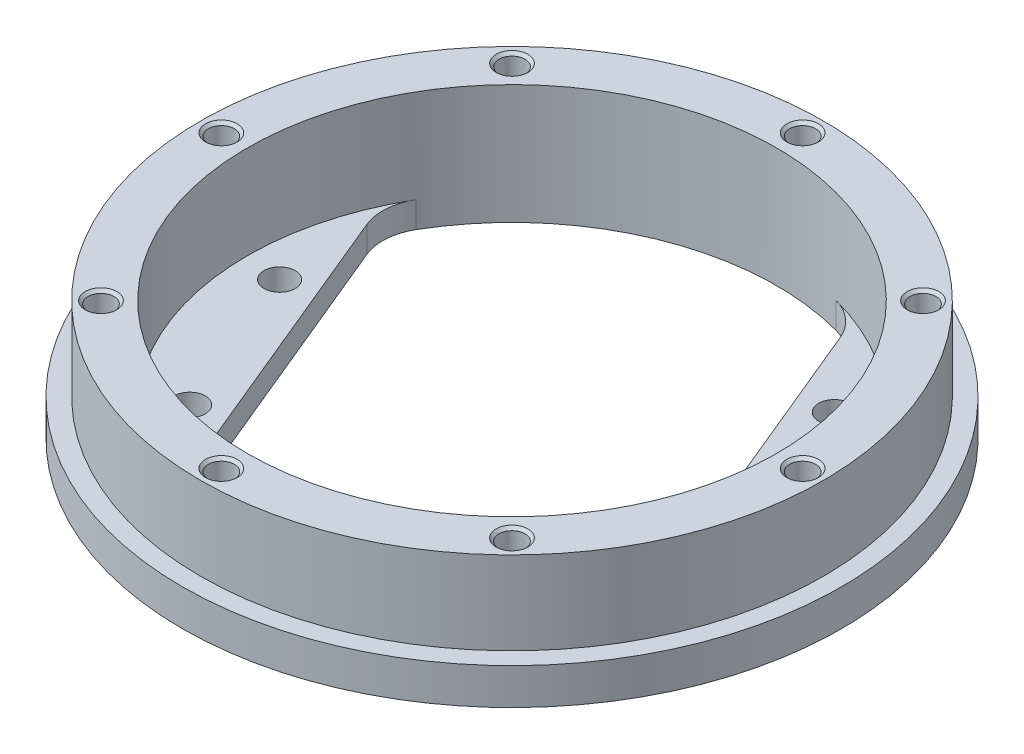
ISO-10303-21;
HEADER;
FILE_DESCRIPTION(('STEP AP214'),'2;1');
FILE_NAME('part.step','',(''),(''),'','','');
FILE_SCHEMA(('AUTOMOTIVE_DESIGN { 1 0 10303 214 1 1 1 1 }'));
ENDSEC;
DATA;
#1=APPLICATION_CONTEXT('core data for automotive mechanical design processes');
#2=APPLICATION_PROTOCOL_DEFINITION('international standard','automotive_design',2000,#1);
#3=PRODUCT_CONTEXT('',#1,'mechanical');
#4=PRODUCT('Part','Part','',(#3));
#5=PRODUCT_RELATED_PRODUCT_CATEGORY('part','',(#4));
#6=PRODUCT_DEFINITION_FORMATION('','',#4);
#7=PRODUCT_DEFINITION_CONTEXT('part definition',#1,'design');
#8=PRODUCT_DEFINITION('design','',#6,#7);
#9=PRODUCT_DEFINITION_SHAPE('','',#8);
#10=(LENGTH_UNIT() NAMED_UNIT(*) SI_UNIT(.MILLI.,.METRE.));
#11=(NAMED_UNIT(*) PLANE_ANGLE_UNIT() SI_UNIT($,.RADIAN.));
#12=(NAMED_UNIT(*) SI_UNIT($,.STERADIAN.) SOLID_ANGLE_UNIT());
#13=UNCERTAINTY_MEASURE_WITH_UNIT(LENGTH_MEASURE(1.E-05),#10,'distance_accuracy_value','');
#14=(GEOMETRIC_REPRESENTATION_CONTEXT(3) GLOBAL_UNCERTAINTY_ASSIGNED_CONTEXT((#13)) GLOBAL_UNIT_ASSIGNED_CONTEXT((#10,
#11,#12)) REPRESENTATION_CONTEXT('',''));
#15=CARTESIAN_POINT('',(0.,0.,0.));
#16=DIRECTION('',(0.,0.,1.));
#17=DIRECTION('',(1.,0.,0.));
#18=AXIS2_PLACEMENT_3D('',#15,#16,#17);
#19=CARTESIAN_POINT('',(0.,8.,0.));
#20=DIRECTION('',(0.,1.,0.));
#21=DIRECTION('',(0.,0.,1.));
#22=AXIS2_PLACEMENT_3D('',#19,#20,#21);
#23=PLANE('',#22);
#24=CARTESIAN_POINT('',(0.,8.,-28.));
#25=DIRECTION('',(0.,1.,0.));
#26=DIRECTION('',(0.,0.,1.));
#27=AXIS2_PLACEMENT_3D('',#24,#25,#26);
#28=CIRCLE('',#27,1.525);
#29=CARTESIAN_POINT('',(0.,8.,-26.475));
#30=VERTEX_POINT('',#29);
#31=EDGE_CURVE('E194',#30,#30,#28,.T.);
#32=ORIENTED_EDGE('',*,*,#31,.F.);
#33=EDGE_LOOP('',(#32));
#34=FACE_BOUND('',#33,.T.);
#35=CARTESIAN_POINT('',(19.7989898732233,8.,-19.7989898732233));
#36=DIRECTION('',(0.,1.,0.));
#37=DIRECTION('',(0.,0.,1.));
#38=AXIS2_PLACEMENT_3D('',#35,#36,#37);
#39=CIRCLE('',#38,1.525);
#40=CARTESIAN_POINT('',(19.7989898732233,8.,-18.2739898732233));
#41=VERTEX_POINT('',#40);
#42=EDGE_CURVE('E201',#41,#41,#39,.T.);
#43=ORIENTED_EDGE('',*,*,#42,.F.);
#44=EDGE_LOOP('',(#43));
#45=FACE_BOUND('',#44,.T.);
#46=CARTESIAN_POINT('',(28.,8.,0.));
#47=DIRECTION('',(0.,1.,0.));
#48=DIRECTION('',(0.,0.,1.));
#49=AXIS2_PLACEMENT_3D('',#46,#47,#48);
#50=CIRCLE('',#49,1.525);
#51=CARTESIAN_POINT('',(28.,8.,1.525));
#52=VERTEX_POINT('',#51);
#53=EDGE_CURVE('E207',#52,#52,#50,.T.);
#54=ORIENTED_EDGE('',*,*,#53,.F.);
#55=EDGE_LOOP('',(#54));
#56=FACE_BOUND('',#55,.T.);
#57=CARTESIAN_POINT('',(19.7989898732233,8.,19.7989898732233));
#58=DIRECTION('',(0.,1.,0.));
#59=DIRECTION('',(0.,0.,1.));
#60=AXIS2_PLACEMENT_3D('',#57,#58,#59);
#61=CIRCLE('',#60,1.525);
#62=CARTESIAN_POINT('',(19.7989898732233,8.,21.3239898732233));
#63=VERTEX_POINT('',#62);
#64=EDGE_CURVE('E213',#63,#63,#61,.T.);
#65=ORIENTED_EDGE('',*,*,#64,.F.);
#66=EDGE_LOOP('',(#65));
#67=FACE_BOUND('',#66,.T.);
#68=CARTESIAN_POINT('',(0.,8.,28.));
#69=DIRECTION('',(0.,1.,0.));
#70=DIRECTION('',(0.,0.,1.));
#71=AXIS2_PLACEMENT_3D('',#68,#69,#70);
#72=CIRCLE('',#71,1.525);
#73=CARTESIAN_POINT('',(0.,8.,29.525));
#74=VERTEX_POINT('',#73);
#75=EDGE_CURVE('E219',#74,#74,#72,.T.);
#76=ORIENTED_EDGE('',*,*,#75,.F.);
#77=EDGE_LOOP('',(#76));
#78=FACE_BOUND('',#77,.T.);
#79=CARTESIAN_POINT('',(-19.7989898732233,8.,19.7989898732233));
#80=DIRECTION('',(0.,1.,0.));
#81=DIRECTION('',(0.,0.,1.));
#82=AXIS2_PLACEMENT_3D('',#79,#80,#81);
#83=CIRCLE('',#82,1.525);
#84=CARTESIAN_POINT('',(-19.7989898732233,8.,21.3239898732233));
#85=VERTEX_POINT('',#84);
#86=EDGE_CURVE('E225',#85,#85,#83,.T.);
#87=ORIENTED_EDGE('',*,*,#86,.F.);
#88=EDGE_LOOP('',(#87));
#89=FACE_BOUND('',#88,.T.);
#90=CARTESIAN_POINT('',(-28.,8.,0.));
#91=DIRECTION('',(0.,1.,0.));
#92=DIRECTION('',(0.,0.,1.));
#93=AXIS2_PLACEMENT_3D('',#90,#91,#92);
#94=CIRCLE('',#93,1.525);
#95=CARTESIAN_POINT('',(-28.,8.,1.52500000000001));
#96=VERTEX_POINT('',#95);
#97=EDGE_CURVE('E231',#96,#96,#94,.T.);
#98=ORIENTED_EDGE('',*,*,#97,.F.);
#99=EDGE_LOOP('',(#98));
#100=FACE_BOUND('',#99,.T.);
#101=CARTESIAN_POINT('',(-19.7989898732233,8.,-19.7989898732233));
#102=DIRECTION('',(0.,1.,0.));
#103=DIRECTION('',(0.,0.,1.));
#104=AXIS2_PLACEMENT_3D('',#101,#102,#103);
#105=CIRCLE('',#104,1.525);
#106=CARTESIAN_POINT('',(-19.7989898732233,8.,-18.2739898732233));
#107=VERTEX_POINT('',#106);
#108=EDGE_CURVE('E237',#107,#107,#105,.T.);
#109=ORIENTED_EDGE('',*,*,#108,.F.);
#110=EDGE_LOOP('',(#109));
#111=FACE_BOUND('',#110,.T.);
#112=CARTESIAN_POINT('',(0.,8.,0.));
#113=DIRECTION('',(0.,1.,0.));
#114=DIRECTION('',(0.,0.,1.));
#115=AXIS2_PLACEMENT_3D('',#112,#113,#114);
#116=CIRCLE('',#115,30.);
#117=CARTESIAN_POINT('',(0.,8.,30.));
#118=VERTEX_POINT('',#117);
#119=EDGE_CURVE('E132',#118,#118,#116,.T.);
#120=ORIENTED_EDGE('',*,*,#119,.T.);
#121=EDGE_LOOP('',(#120));
#122=FACE_BOUND('',#121,.T.);
#123=CARTESIAN_POINT('',(0.,8.,0.));
#124=DIRECTION('',(0.,1.,0.));
#125=DIRECTION('',(0.,0.,1.));
#126=AXIS2_PLACEMENT_3D('',#123,#124,#125);
#127=CIRCLE('',#126,25.5);
#128=CARTESIAN_POINT('',(0.,8.,25.5));
#129=VERTEX_POINT('',#128);
#130=EDGE_CURVE('E137',#129,#129,#127,.T.);
#131=ORIENTED_EDGE('',*,*,#130,.F.);
#132=EDGE_LOOP('',(#131));
#133=FACE_BOUND('',#132,.T.);
#134=ADVANCED_FACE('F38',(#34,#45,#56,#67,#78,#89,#100,#111,#122,#133),#23,.T.);
#135=CARTESIAN_POINT('',(0.,8.,0.));
#136=DIRECTION('',(0.,-1.,0.));
#137=DIRECTION('',(0.,0.,-1.));
#138=AXIS2_PLACEMENT_3D('',#135,#136,#137);
#139=CYLINDRICAL_SURFACE('',#138,30.);
#140=ORIENTED_EDGE('',*,*,#119,.F.);
#141=EDGE_LOOP('',(#140));
#142=FACE_BOUND('',#141,.T.);
#143=CARTESIAN_POINT('',(0.,0.,0.));
#144=DIRECTION('',(0.,1.,0.));
#145=DIRECTION('',(0.,0.,1.));
#146=AXIS2_PLACEMENT_3D('',#143,#144,#145);
#147=CIRCLE('',#146,30.);
#148=CARTESIAN_POINT('',(0.,0.,30.));
#149=VERTEX_POINT('',#148);
#150=EDGE_CURVE('E140',#149,#149,#147,.T.);
#151=ORIENTED_EDGE('',*,*,#150,.T.);
#152=EDGE_LOOP('',(#151));
#153=FACE_BOUND('',#152,.T.);
#154=ADVANCED_FACE('F280',(#142,#153),#139,.T.);
#155=CARTESIAN_POINT('',(0.,8.,0.));
#156=DIRECTION('',(0.,-1.,0.));
#157=DIRECTION('',(0.,0.,-1.));
#158=AXIS2_PLACEMENT_3D('',#155,#156,#157);
#159=CYLINDRICAL_SURFACE('',#158,25.5);
#160=CARTESIAN_POINT('',(0.,-3.5,0.));
#161=DIRECTION('',(0.,-1.,0.));
#162=DIRECTION('',(0.,0.,-1.));
#163=AXIS2_PLACEMENT_3D('',#160,#161,#162);
#164=CIRCLE('',#163,25.5);
#165=CARTESIAN_POINT('',(22.0604151642017,-3.5,12.7901556981555));
#166=VERTEX_POINT('',#165);
#167=CARTESIAN_POINT('',(-6.55506333180038,-3.5,24.643074984995));
#168=VERTEX_POINT('',#167);
#169=EDGE_CURVE('E166',#166,#168,#164,.T.);
#170=ORIENTED_EDGE('',*,*,#169,.T.);
#171=DIRECTION('',(0.,-1.,0.));
#172=VECTOR('',#171,1.);
#173=CARTESIAN_POINT('',(-6.55506333180038,8.,24.643074984995));
#174=LINE('',#173,#172);
#175=CARTESIAN_POINT('',(-6.55506333180038,-1.,24.643074984995));
#176=VERTEX_POINT('',#175);
#177=EDGE_CURVE('E149',#168,#176,#174,.F.);
#178=ORIENTED_EDGE('',*,*,#177,.T.);
#179=CARTESIAN_POINT('',(0.,-1.,0.));
#180=DIRECTION('',(0.,-1.,0.));
#181=DIRECTION('',(0.,0.,-1.));
#182=AXIS2_PLACEMENT_3D('',#179,#180,#181);
#183=CIRCLE('',#182,25.5);
#184=CARTESIAN_POINT('',(-22.0604151642017,-1.,-12.7901556981555));
#185=VERTEX_POINT('',#184);
#186=EDGE_CURVE('E126',#176,#185,#183,.T.);
#187=ORIENTED_EDGE('',*,*,#186,.T.);
#188=DIRECTION('',(0.,-1.,0.));
#189=VECTOR('',#188,1.);
#190=CARTESIAN_POINT('',(-22.0604151642017,8.,-12.7901556981555));
#191=LINE('',#190,#189);
#192=CARTESIAN_POINT('',(-22.0604151642017,-3.5,-12.7901556981555));
#193=VERTEX_POINT('',#192);
#194=EDGE_CURVE('E147',#185,#193,#191,.T.);
#195=ORIENTED_EDGE('',*,*,#194,.T.);
#196=CARTESIAN_POINT('',(6.55506333180039,-3.5,-24.643074984995));
#197=VERTEX_POINT('',#196);
#198=EDGE_CURVE('E110',#193,#197,#164,.T.);
#199=ORIENTED_EDGE('',*,*,#198,.T.);
#200=DIRECTION('',(0.,-1.,0.));
#201=VECTOR('',#200,1.);
#202=CARTESIAN_POINT('',(6.55506333180039,8.,-24.643074984995));
#203=LINE('',#202,#201);
#204=CARTESIAN_POINT('',(6.5550633318004,-1.,-24.643074984995));
#205=VERTEX_POINT('',#204);
#206=EDGE_CURVE('E144',#197,#205,#203,.F.);
#207=ORIENTED_EDGE('',*,*,#206,.T.);
#208=CARTESIAN_POINT('',(0.,-1.,0.));
#209=DIRECTION('',(0.,-1.,0.));
#210=DIRECTION('',(0.,0.,1.));
#211=AXIS2_PLACEMENT_3D('',#208,#209,#210);
#212=CIRCLE('',#211,25.5);
#213=CARTESIAN_POINT('',(22.0604151642017,-1.,12.7901556981555));
#214=VERTEX_POINT('',#213);
#215=EDGE_CURVE('E171',#205,#214,#212,.T.);
#216=ORIENTED_EDGE('',*,*,#215,.T.);
#217=DIRECTION('',(0.,-1.,0.));
#218=VECTOR('',#217,1.);
#219=CARTESIAN_POINT('',(22.0604151642017,8.,12.7901556981555));
#220=LINE('',#219,#218);
#221=EDGE_CURVE('E134',#214,#166,#220,.T.);
#222=ORIENTED_EDGE('',*,*,#221,.T.);
#223=EDGE_LOOP('',(#170,#178,#187,#195,#199,#207,#216,#222));
#224=FACE_BOUND('',#223,.T.);
#225=ORIENTED_EDGE('',*,*,#130,.T.);
#226=EDGE_LOOP('',(#225));
#227=FACE_BOUND('',#226,.T.);
#228=ADVANCED_FACE('F307',(#224,#227),#159,.F.);
#229=CARTESIAN_POINT('',(0.,-3.5,0.));
#230=DIRECTION('',(0.,-1.,0.));
#231=DIRECTION('',(0.,0.,-1.));
#232=AXIS2_PLACEMENT_3D('',#229,#230,#231);
#233=PLANE('',#232);
#234=CARTESIAN_POINT('',(0.,-3.5,-28.));
#235=DIRECTION('',(0.,1.,0.));
#236=DIRECTION('',(0.,0.,1.));
#237=AXIS2_PLACEMENT_3D('',#234,#235,#236);
#238=CIRCLE('',#237,1.25);
#239=CARTESIAN_POINT('',(0.,-3.5,-26.75));
#240=VERTEX_POINT('',#239);
#241=EDGE_CURVE('E244',#240,#240,#238,.T.);
#242=ORIENTED_EDGE('',*,*,#241,.T.);
#243=EDGE_LOOP('',(#242));
#244=FACE_BOUND('',#243,.T.);
#245=CARTESIAN_POINT('',(19.7989898732233,-3.5,-19.7989898732233));
#246=DIRECTION('',(0.,1.,0.));
#247=DIRECTION('',(0.,0.,1.));
#248=AXIS2_PLACEMENT_3D('',#245,#246,#247);
#249=CIRCLE('',#248,1.25);
#250=CARTESIAN_POINT('',(19.7989898732233,-3.5,-18.5489898732233));
#251=VERTEX_POINT('',#250);
#252=EDGE_CURVE('E247',#251,#251,#249,.T.);
#253=ORIENTED_EDGE('',*,*,#252,.T.);
#254=EDGE_LOOP('',(#253));
#255=FACE_BOUND('',#254,.T.);
#256=CARTESIAN_POINT('',(28.,-3.5,0.));
#257=DIRECTION('',(0.,1.,0.));
#258=DIRECTION('',(0.,0.,1.));
#259=AXIS2_PLACEMENT_3D('',#256,#257,#258);
#260=CIRCLE('',#259,1.25);
#261=CARTESIAN_POINT('',(28.,-3.5,1.25));
#262=VERTEX_POINT('',#261);
#263=EDGE_CURVE('E250',#262,#262,#260,.T.);
#264=ORIENTED_EDGE('',*,*,#263,.T.);
#265=EDGE_LOOP('',(#264));
#266=FACE_BOUND('',#265,.T.);
#267=CARTESIAN_POINT('',(19.7989898732233,-3.5,19.7989898732233));
#268=DIRECTION('',(0.,1.,0.));
#269=DIRECTION('',(0.,0.,1.));
#270=AXIS2_PLACEMENT_3D('',#267,#268,#269);
#271=CIRCLE('',#270,1.25);
#272=CARTESIAN_POINT('',(19.7989898732233,-3.5,21.0489898732233));
#273=VERTEX_POINT('',#272);
#274=EDGE_CURVE('E253',#273,#273,#271,.T.);
#275=ORIENTED_EDGE('',*,*,#274,.T.);
#276=EDGE_LOOP('',(#275));
#277=FACE_BOUND('',#276,.T.);
#278=CARTESIAN_POINT('',(0.,-3.5,28.));
#279=DIRECTION('',(0.,1.,0.));
#280=DIRECTION('',(0.,0.,1.));
#281=AXIS2_PLACEMENT_3D('',#278,#279,#280);
#282=CIRCLE('',#281,1.25);
#283=CARTESIAN_POINT('',(0.,-3.5,29.25));
#284=VERTEX_POINT('',#283);
#285=EDGE_CURVE('E256',#284,#284,#282,.T.);
#286=ORIENTED_EDGE('',*,*,#285,.T.);
#287=EDGE_LOOP('',(#286));
#288=FACE_BOUND('',#287,.T.);
#289=CARTESIAN_POINT('',(-19.7989898732233,-3.5,19.7989898732233));
#290=DIRECTION('',(0.,1.,0.));
#291=DIRECTION('',(0.,0.,1.));
#292=AXIS2_PLACEMENT_3D('',#289,#290,#291);
#293=CIRCLE('',#292,1.25);
#294=CARTESIAN_POINT('',(-19.7989898732233,-3.5,21.0489898732233));
#295=VERTEX_POINT('',#294);
#296=EDGE_CURVE('E259',#295,#295,#293,.T.);
#297=ORIENTED_EDGE('',*,*,#296,.T.);
#298=EDGE_LOOP('',(#297));
#299=FACE_BOUND('',#298,.T.);
#300=CARTESIAN_POINT('',(-28.,-3.5,0.));
#301=DIRECTION('',(0.,1.,0.));
#302=DIRECTION('',(0.,0.,1.));
#303=AXIS2_PLACEMENT_3D('',#300,#301,#302);
#304=CIRCLE('',#303,1.25);
#305=CARTESIAN_POINT('',(-28.,-3.5,1.25000000000001));
#306=VERTEX_POINT('',#305);
#307=EDGE_CURVE('E262',#306,#306,#304,.T.);
#308=ORIENTED_EDGE('',*,*,#307,.T.);
#309=EDGE_LOOP('',(#308));
#310=FACE_BOUND('',#309,.T.);
#311=CARTESIAN_POINT('',(-19.7989898732233,-3.5,-19.7989898732233));
#312=DIRECTION('',(0.,1.,0.));
#313=DIRECTION('',(0.,0.,1.));
#314=AXIS2_PLACEMENT_3D('',#311,#312,#313);
#315=CIRCLE('',#314,1.25);
#316=CARTESIAN_POINT('',(-19.7989898732233,-3.5,-18.5489898732233));
#317=VERTEX_POINT('',#316);
#318=EDGE_CURVE('E243',#317,#317,#315,.T.);
#319=ORIENTED_EDGE('',*,*,#318,.T.);
#320=EDGE_LOOP('',(#319));
#321=FACE_BOUND('',#320,.T.);
#322=CARTESIAN_POINT('',(0.,-3.5,0.));
#323=DIRECTION('',(0.,-1.,0.));
#324=DIRECTION('',(0.,0.,-1.));
#325=AXIS2_PLACEMENT_3D('',#322,#323,#324);
#326=CIRCLE('',#325,31.75);
#327=CARTESIAN_POINT('',(0.,-3.5,-31.75));
#328=VERTEX_POINT('',#327);
#329=EDGE_CURVE('E269',#328,#328,#326,.T.);
#330=ORIENTED_EDGE('',*,*,#329,.T.);
#331=EDGE_LOOP('',(#330));
#332=FACE_BOUND('',#331,.T.);
#333=ORIENTED_EDGE('',*,*,#198,.F.);
#334=CARTESIAN_POINT('',(-17.7348435633778,-3.5,-10.2822820318505));
#335=DIRECTION('',(0.,-1.,0.));
#336=DIRECTION('',(0.,0.,-1.));
#337=AXIS2_PLACEMENT_3D('',#334,#335,#336);
#338=CIRCLE('',#337,5.);
#339=CARTESIAN_POINT('',(-22.3542412259343,-3.5,-8.36886487002507));
#340=VERTEX_POINT('',#339);
#341=EDGE_CURVE('E104',#193,#340,#338,.F.);
#342=ORIENTED_EDGE('',*,*,#341,.T.);
#343=DIRECTION('',(0.382683432365084,0.,0.923879532511289));
#344=VECTOR('',#343,1.);
#345=CARTESIAN_POINT('',(-23.2374233208555,-3.5,-10.5010550616289));
#346=LINE('',#345,#344);
#347=CARTESIAN_POINT('',(-9.8891544587097,-3.5,21.7245166595665));
#348=VERTEX_POINT('',#347);
#349=EDGE_CURVE('E108',#340,#348,#346,.T.);
#350=ORIENTED_EDGE('',*,*,#349,.T.);
#351=CARTESIAN_POINT('',(-5.26975679615325,-3.5,19.8110994977411));
#352=DIRECTION('',(0.,-1.,0.));
#353=DIRECTION('',(0.,0.,-1.));
#354=AXIS2_PLACEMENT_3D('',#351,#352,#353);
#355=CIRCLE('',#354,5.);
#356=EDGE_CURVE('E156',#348,#168,#355,.F.);
#357=ORIENTED_EDGE('',*,*,#356,.T.);
#358=ORIENTED_EDGE('',*,*,#169,.F.);
#359=CARTESIAN_POINT('',(17.7348435633778,-3.5,10.2822820318505));
#360=DIRECTION('',(0.,-1.,0.));
#361=DIRECTION('',(0.,0.,-1.));
#362=AXIS2_PLACEMENT_3D('',#359,#360,#361);
#363=CIRCLE('',#362,5.);
#364=CARTESIAN_POINT('',(22.3542412259343,-3.5,8.36886487002507));
#365=VERTEX_POINT('',#364);
#366=EDGE_CURVE('E46',#166,#365,#363,.F.);
#367=ORIENTED_EDGE('',*,*,#366,.T.);
#368=DIRECTION('',(-0.382683432365084,0.,-0.923879532511289));
#369=VECTOR('',#368,1.);
#370=CARTESIAN_POINT('',(9.0059723637885,-3.5,-23.8567068511704));
#371=LINE('',#370,#369);
#372=CARTESIAN_POINT('',(9.8891544587097,-3.5,-21.7245166595665));
#373=VERTEX_POINT('',#372);
#374=EDGE_CURVE('E164',#365,#373,#371,.T.);
#375=ORIENTED_EDGE('',*,*,#374,.T.);
#376=CARTESIAN_POINT('',(5.26975679615326,-3.5,-19.8110994977411));
#377=DIRECTION('',(0.,-1.,0.));
#378=DIRECTION('',(0.,0.,-1.));
#379=AXIS2_PLACEMENT_3D('',#376,#377,#378);
#380=CIRCLE('',#379,5.);
#381=EDGE_CURVE('E160',#373,#197,#380,.F.);
#382=ORIENTED_EDGE('',*,*,#381,.T.);
#383=EDGE_LOOP('',(#333,#342,#350,#357,#358,#367,#375,#382));
#384=FACE_BOUND('',#383,.T.);
#385=CARTESIAN_POINT('',(-15.8318689809352,-3.5,15.2169124519563));
#386=DIRECTION('',(0.,-1.,0.));
#387=DIRECTION('',(0.,0.,-1.));
#388=AXIS2_PLACEMENT_3D('',#385,#386,#387);
#389=CIRCLE('',#388,1.5);
#390=CARTESIAN_POINT('',(-15.8318689809352,-3.5,13.7169124519563));
#391=VERTEX_POINT('',#390);
#392=EDGE_CURVE('E177',#391,#391,#389,.T.);
#393=ORIENTED_EDGE('',*,*,#392,.F.);
#394=EDGE_LOOP('',(#393));
#395=FACE_BOUND('',#394,.T.);
#396=CARTESIAN_POINT('',(-21.9548038987765,-3.5,0.434839931775646));
#397=DIRECTION('',(0.,-1.,0.));
#398=DIRECTION('',(0.,0.,-1.));
#399=AXIS2_PLACEMENT_3D('',#396,#397,#398);
#400=CIRCLE('',#399,1.5);
#401=CARTESIAN_POINT('',(-21.9548038987765,-3.5,-1.06516006822435));
#402=VERTEX_POINT('',#401);
#403=EDGE_CURVE('E186',#402,#402,#400,.T.);
#404=ORIENTED_EDGE('',*,*,#403,.F.);
#405=EDGE_LOOP('',(#404));
#406=FACE_BOUND('',#405,.T.);
#407=CARTESIAN_POINT('',(15.8318689809352,-3.5,-15.2169124519563));
#408=DIRECTION('',(0.,-1.,0.));
#409=DIRECTION('',(0.,0.,1.));
#410=AXIS2_PLACEMENT_3D('',#407,#408,#409);
#411=CIRCLE('',#410,1.5);
#412=CARTESIAN_POINT('',(15.8318689809352,-3.5,-13.7169124519563));
#413=VERTEX_POINT('',#412);
#414=EDGE_CURVE('E662',#413,#413,#411,.T.);
#415=ORIENTED_EDGE('',*,*,#414,.F.);
#416=EDGE_LOOP('',(#415));
#417=FACE_BOUND('',#416,.T.);
#418=CARTESIAN_POINT('',(21.9548038987765,-3.5,-0.434839931775658));
#419=DIRECTION('',(0.,-1.,0.));
#420=DIRECTION('',(0.,0.,1.));
#421=AXIS2_PLACEMENT_3D('',#418,#419,#420);
#422=CIRCLE('',#421,1.5);
#423=CARTESIAN_POINT('',(21.9548038987765,-3.5,1.06516006822434));
#424=VERTEX_POINT('',#423);
#425=EDGE_CURVE('E658',#424,#424,#422,.T.);
#426=ORIENTED_EDGE('',*,*,#425,.F.);
#427=EDGE_LOOP('',(#426));
#428=FACE_BOUND('',#427,.T.);
#429=ADVANCED_FACE('F106',(#244,#255,#266,#277,#288,#299,#310,#321,#332,#384,#395,#406,#417,
#428),#233,.T.);
#430=CARTESIAN_POINT('',(0.,0.,0.));
#431=DIRECTION('',(0.,-1.,0.));
#432=DIRECTION('',(0.,0.,-1.));
#433=AXIS2_PLACEMENT_3D('',#430,#431,#432);
#434=PLANE('',#433);
#435=ORIENTED_EDGE('',*,*,#150,.F.);
#436=EDGE_LOOP('',(#435));
#437=FACE_BOUND('',#436,.T.);
#438=CARTESIAN_POINT('',(0.,0.,0.));
#439=DIRECTION('',(0.,-1.,0.));
#440=DIRECTION('',(0.,0.,-1.));
#441=AXIS2_PLACEMENT_3D('',#438,#439,#440);
#442=CIRCLE('',#441,31.75);
#443=CARTESIAN_POINT('',(0.,0.,-31.75));
#444=VERTEX_POINT('',#443);
#445=EDGE_CURVE('E268',#444,#444,#442,.T.);
#446=ORIENTED_EDGE('',*,*,#445,.F.);
#447=EDGE_LOOP('',(#446));
#448=FACE_BOUND('',#447,.T.);
#449=ADVANCED_FACE('F282',(#437,#448),#434,.F.);
#450=CARTESIAN_POINT('',(0.,-3.5,0.));
#451=DIRECTION('',(0.,1.,0.));
#452=DIRECTION('',(0.,0.,1.));
#453=AXIS2_PLACEMENT_3D('',#450,#451,#452);
#454=CYLINDRICAL_SURFACE('',#453,31.75);
#455=ORIENTED_EDGE('',*,*,#329,.F.);
#456=EDGE_LOOP('',(#455));
#457=FACE_BOUND('',#456,.T.);
#458=ORIENTED_EDGE('',*,*,#445,.T.);
#459=EDGE_LOOP('',(#458));
#460=FACE_BOUND('',#459,.T.);
#461=ADVANCED_FACE('F285',(#457,#460),#454,.T.);
#462=CARTESIAN_POINT('',(-19.7989898732233,-3.5,-19.7989898732233));
#463=DIRECTION('',(0.,1.,0.));
#464=DIRECTION('',(0.,0.,1.));
#465=AXIS2_PLACEMENT_3D('',#462,#463,#464);
#466=CYLINDRICAL_SURFACE('',#465,1.25);
#467=CARTESIAN_POINT('',(-19.7989898732233,7.725,-19.7989898732233));
#468=DIRECTION('',(0.,1.,0.));
#469=DIRECTION('',(0.,0.,1.));
#470=AXIS2_PLACEMENT_3D('',#467,#468,#469);
#471=CIRCLE('',#470,1.25);
#472=CARTESIAN_POINT('',(-19.7989898732233,7.725,-18.5489898732233));
#473=VERTEX_POINT('',#472);
#474=EDGE_CURVE('E240',#473,#473,#471,.T.);
#475=ORIENTED_EDGE('',*,*,#474,.T.);
#476=EDGE_LOOP('',(#475));
#477=FACE_BOUND('',#476,.T.);
#478=ORIENTED_EDGE('',*,*,#318,.F.);
#479=EDGE_LOOP('',(#478));
#480=FACE_BOUND('',#479,.T.);
#481=ADVANCED_FACE('F290',(#477,#480),#466,.F.);
#482=CARTESIAN_POINT('',(-28.,-3.5,0.));
#483=DIRECTION('',(0.,1.,0.));
#484=DIRECTION('',(0.,0.,1.));
#485=AXIS2_PLACEMENT_3D('',#482,#483,#484);
#486=CYLINDRICAL_SURFACE('',#485,1.25);
#487=CARTESIAN_POINT('',(-28.,7.725,0.));
#488=DIRECTION('',(0.,1.,0.));
#489=DIRECTION('',(0.,0.,1.));
#490=AXIS2_PLACEMENT_3D('',#487,#488,#489);
#491=CIRCLE('',#490,1.25);
#492=CARTESIAN_POINT('',(-28.,7.725,1.25));
#493=VERTEX_POINT('',#492);
#494=EDGE_CURVE('E234',#493,#493,#491,.T.);
#495=ORIENTED_EDGE('',*,*,#494,.T.);
#496=EDGE_LOOP('',(#495));
#497=FACE_BOUND('',#496,.T.);
#498=ORIENTED_EDGE('',*,*,#307,.F.);
#499=EDGE_LOOP('',(#498));
#500=FACE_BOUND('',#499,.T.);
#501=ADVANCED_FACE('F296',(#497,#500),#486,.F.);
#502=CARTESIAN_POINT('',(-19.7989898732233,-3.5,19.7989898732233));
#503=DIRECTION('',(0.,1.,0.));
#504=DIRECTION('',(0.,0.,1.));
#505=AXIS2_PLACEMENT_3D('',#502,#503,#504);
#506=CYLINDRICAL_SURFACE('',#505,1.25);
#507=CARTESIAN_POINT('',(-19.7989898732233,7.725,19.7989898732233));
#508=DIRECTION('',(0.,1.,0.));
#509=DIRECTION('',(0.,0.,1.));
#510=AXIS2_PLACEMENT_3D('',#507,#508,#509);
#511=CIRCLE('',#510,1.25);
#512=CARTESIAN_POINT('',(-19.7989898732233,7.725,21.0489898732233));
#513=VERTEX_POINT('',#512);
#514=EDGE_CURVE('E228',#513,#513,#511,.T.);
#515=ORIENTED_EDGE('',*,*,#514,.T.);
#516=EDGE_LOOP('',(#515));
#517=FACE_BOUND('',#516,.T.);
#518=ORIENTED_EDGE('',*,*,#296,.F.);
#519=EDGE_LOOP('',(#518));
#520=FACE_BOUND('',#519,.T.);
#521=ADVANCED_FACE('F397',(#517,#520),#506,.F.);
#522=CARTESIAN_POINT('',(0.,-3.5,28.));
#523=DIRECTION('',(0.,1.,0.));
#524=DIRECTION('',(0.,0.,1.));
#525=AXIS2_PLACEMENT_3D('',#522,#523,#524);
#526=CYLINDRICAL_SURFACE('',#525,1.25);
#527=CARTESIAN_POINT('',(0.,7.725,28.));
#528=DIRECTION('',(0.,1.,0.));
#529=DIRECTION('',(0.,0.,1.));
#530=AXIS2_PLACEMENT_3D('',#527,#528,#529);
#531=CIRCLE('',#530,1.25);
#532=CARTESIAN_POINT('',(0.,7.725,29.25));
#533=VERTEX_POINT('',#532);
#534=EDGE_CURVE('E222',#533,#533,#531,.T.);
#535=ORIENTED_EDGE('',*,*,#534,.T.);
#536=EDGE_LOOP('',(#535));
#537=FACE_BOUND('',#536,.T.);
#538=ORIENTED_EDGE('',*,*,#285,.F.);
#539=EDGE_LOOP('',(#538));
#540=FACE_BOUND('',#539,.T.);
#541=ADVANCED_FACE('F393',(#537,#540),#526,.F.);
#542=CARTESIAN_POINT('',(19.7989898732233,-3.5,19.7989898732233));
#543=DIRECTION('',(0.,1.,0.));
#544=DIRECTION('',(0.,0.,1.));
#545=AXIS2_PLACEMENT_3D('',#542,#543,#544);
#546=CYLINDRICAL_SURFACE('',#545,1.25);
#547=CARTESIAN_POINT('',(19.7989898732233,7.725,19.7989898732233));
#548=DIRECTION('',(0.,1.,0.));
#549=DIRECTION('',(0.,0.,1.));
#550=AXIS2_PLACEMENT_3D('',#547,#548,#549);
#551=CIRCLE('',#550,1.25);
#552=CARTESIAN_POINT('',(19.7989898732233,7.725,21.0489898732233));
#553=VERTEX_POINT('',#552);
#554=EDGE_CURVE('E216',#553,#553,#551,.T.);
#555=ORIENTED_EDGE('',*,*,#554,.T.);
#556=EDGE_LOOP('',(#555));
#557=FACE_BOUND('',#556,.T.);
#558=ORIENTED_EDGE('',*,*,#274,.F.);
#559=EDGE_LOOP('',(#558));
#560=FACE_BOUND('',#559,.T.);
#561=ADVANCED_FACE('F389',(#557,#560),#546,.F.);
#562=CARTESIAN_POINT('',(28.,-3.5,0.));
#563=DIRECTION('',(0.,1.,0.));
#564=DIRECTION('',(0.,0.,1.));
#565=AXIS2_PLACEMENT_3D('',#562,#563,#564);
#566=CYLINDRICAL_SURFACE('',#565,1.25);
#567=CARTESIAN_POINT('',(28.,7.725,0.));
#568=DIRECTION('',(0.,1.,0.));
#569=DIRECTION('',(0.,0.,1.));
#570=AXIS2_PLACEMENT_3D('',#567,#568,#569);
#571=CIRCLE('',#570,1.25);
#572=CARTESIAN_POINT('',(28.,7.725,1.24999999999999));
#573=VERTEX_POINT('',#572);
#574=EDGE_CURVE('E210',#573,#573,#571,.T.);
#575=ORIENTED_EDGE('',*,*,#574,.T.);
#576=EDGE_LOOP('',(#575));
#577=FACE_BOUND('',#576,.T.);
#578=ORIENTED_EDGE('',*,*,#263,.F.);
#579=EDGE_LOOP('',(#578));
#580=FACE_BOUND('',#579,.T.);
#581=ADVANCED_FACE('F385',(#577,#580),#566,.F.);
#582=CARTESIAN_POINT('',(19.7989898732233,-3.5,-19.7989898732233));
#583=DIRECTION('',(0.,1.,0.));
#584=DIRECTION('',(0.,0.,1.));
#585=AXIS2_PLACEMENT_3D('',#582,#583,#584);
#586=CYLINDRICAL_SURFACE('',#585,1.25);
#587=CARTESIAN_POINT('',(19.7989898732233,7.725,-19.7989898732233));
#588=DIRECTION('',(0.,1.,0.));
#589=DIRECTION('',(0.,0.,1.));
#590=AXIS2_PLACEMENT_3D('',#587,#588,#589);
#591=CIRCLE('',#590,1.25);
#592=CARTESIAN_POINT('',(19.7989898732233,7.725,-18.5489898732233));
#593=VERTEX_POINT('',#592);
#594=EDGE_CURVE('E204',#593,#593,#591,.T.);
#595=ORIENTED_EDGE('',*,*,#594,.T.);
#596=EDGE_LOOP('',(#595));
#597=FACE_BOUND('',#596,.T.);
#598=ORIENTED_EDGE('',*,*,#252,.F.);
#599=EDGE_LOOP('',(#598));
#600=FACE_BOUND('',#599,.T.);
#601=ADVANCED_FACE('F381',(#597,#600),#586,.F.);
#602=CARTESIAN_POINT('',(0.,-3.5,-28.));
#603=DIRECTION('',(0.,1.,0.));
#604=DIRECTION('',(0.,0.,1.));
#605=AXIS2_PLACEMENT_3D('',#602,#603,#604);
#606=CYLINDRICAL_SURFACE('',#605,1.25);
#607=CARTESIAN_POINT('',(0.,7.725,-28.));
#608=DIRECTION('',(0.,1.,0.));
#609=DIRECTION('',(0.,0.,1.));
#610=AXIS2_PLACEMENT_3D('',#607,#608,#609);
#611=CIRCLE('',#610,1.25);
#612=CARTESIAN_POINT('',(0.,7.725,-26.75));
#613=VERTEX_POINT('',#612);
#614=EDGE_CURVE('E198',#613,#613,#611,.T.);
#615=ORIENTED_EDGE('',*,*,#614,.T.);
#616=EDGE_LOOP('',(#615));
#617=FACE_BOUND('',#616,.T.);
#618=ORIENTED_EDGE('',*,*,#241,.F.);
#619=EDGE_LOOP('',(#618));
#620=FACE_BOUND('',#619,.T.);
#621=ADVANCED_FACE('F377',(#617,#620),#606,.F.);
#622=CARTESIAN_POINT('',(-19.7989898732233,8.,-19.7989898732233));
#623=DIRECTION('',(0.,1.,0.));
#624=DIRECTION('',(0.,0.,1.));
#625=AXIS2_PLACEMENT_3D('',#622,#623,#624);
#626=CONICAL_SURFACE('',#625,1.525,0.785398163397455);
#627=ORIENTED_EDGE('',*,*,#474,.F.);
#628=EDGE_LOOP('',(#627));
#629=FACE_BOUND('',#628,.T.);
#630=ORIENTED_EDGE('',*,*,#108,.T.);
#631=EDGE_LOOP('',(#630));
#632=FACE_BOUND('',#631,.T.);
#633=ADVANCED_FACE('F373',(#629,#632),#626,.F.);
#634=CARTESIAN_POINT('',(-28.,8.,0.));
#635=DIRECTION('',(0.,1.,0.));
#636=DIRECTION('',(0.,0.,1.));
#637=AXIS2_PLACEMENT_3D('',#634,#635,#636);
#638=CONICAL_SURFACE('',#637,1.525,0.785398163397455);
#639=ORIENTED_EDGE('',*,*,#494,.F.);
#640=EDGE_LOOP('',(#639));
#641=FACE_BOUND('',#640,.T.);
#642=ORIENTED_EDGE('',*,*,#97,.T.);
#643=EDGE_LOOP('',(#642));
#644=FACE_BOUND('',#643,.T.);
#645=ADVANCED_FACE('F369',(#641,#644),#638,.F.);
#646=CARTESIAN_POINT('',(-19.7989898732233,8.,19.7989898732233));
#647=DIRECTION('',(0.,1.,0.));
#648=DIRECTION('',(0.,0.,1.));
#649=AXIS2_PLACEMENT_3D('',#646,#647,#648);
#650=CONICAL_SURFACE('',#649,1.525,0.785398163397455);
#651=ORIENTED_EDGE('',*,*,#514,.F.);
#652=EDGE_LOOP('',(#651));
#653=FACE_BOUND('',#652,.T.);
#654=ORIENTED_EDGE('',*,*,#86,.T.);
#655=EDGE_LOOP('',(#654));
#656=FACE_BOUND('',#655,.T.);
#657=ADVANCED_FACE('F365',(#653,#656),#650,.F.);
#658=CARTESIAN_POINT('',(0.,8.,28.));
#659=DIRECTION('',(0.,1.,0.));
#660=DIRECTION('',(0.,0.,1.));
#661=AXIS2_PLACEMENT_3D('',#658,#659,#660);
#662=CONICAL_SURFACE('',#661,1.525,0.785398163397455);
#663=ORIENTED_EDGE('',*,*,#534,.F.);
#664=EDGE_LOOP('',(#663));
#665=FACE_BOUND('',#664,.T.);
#666=ORIENTED_EDGE('',*,*,#75,.T.);
#667=EDGE_LOOP('',(#666));
#668=FACE_BOUND('',#667,.T.);
#669=ADVANCED_FACE('F361',(#665,#668),#662,.F.);
#670=CARTESIAN_POINT('',(19.7989898732233,8.,19.7989898732233));
#671=DIRECTION('',(0.,1.,0.));
#672=DIRECTION('',(0.,0.,1.));
#673=AXIS2_PLACEMENT_3D('',#670,#671,#672);
#674=CONICAL_SURFACE('',#673,1.525,0.785398163397455);
#675=ORIENTED_EDGE('',*,*,#554,.F.);
#676=EDGE_LOOP('',(#675));
#677=FACE_BOUND('',#676,.T.);
#678=ORIENTED_EDGE('',*,*,#64,.T.);
#679=EDGE_LOOP('',(#678));
#680=FACE_BOUND('',#679,.T.);
#681=ADVANCED_FACE('F357',(#677,#680),#674,.F.);
#682=CARTESIAN_POINT('',(28.,8.,0.));
#683=DIRECTION('',(0.,1.,0.));
#684=DIRECTION('',(0.,0.,1.));
#685=AXIS2_PLACEMENT_3D('',#682,#683,#684);
#686=CONICAL_SURFACE('',#685,1.525,0.785398163397455);
#687=ORIENTED_EDGE('',*,*,#574,.F.);
#688=EDGE_LOOP('',(#687));
#689=FACE_BOUND('',#688,.T.);
#690=ORIENTED_EDGE('',*,*,#53,.T.);
#691=EDGE_LOOP('',(#690));
#692=FACE_BOUND('',#691,.T.);
#693=ADVANCED_FACE('F353',(#689,#692),#686,.F.);
#694=CARTESIAN_POINT('',(19.7989898732233,8.,-19.7989898732233));
#695=DIRECTION('',(0.,1.,0.));
#696=DIRECTION('',(0.,0.,1.));
#697=AXIS2_PLACEMENT_3D('',#694,#695,#696);
#698=CONICAL_SURFACE('',#697,1.525,0.785398163397455);
#699=ORIENTED_EDGE('',*,*,#594,.F.);
#700=EDGE_LOOP('',(#699));
#701=FACE_BOUND('',#700,.T.);
#702=ORIENTED_EDGE('',*,*,#42,.T.);
#703=EDGE_LOOP('',(#702));
#704=FACE_BOUND('',#703,.T.);
#705=ADVANCED_FACE('F349',(#701,#704),#698,.F.);
#706=CARTESIAN_POINT('',(0.,8.,-28.));
#707=DIRECTION('',(0.,1.,0.));
#708=DIRECTION('',(0.,0.,1.));
#709=AXIS2_PLACEMENT_3D('',#706,#707,#708);
#710=CONICAL_SURFACE('',#709,1.525,0.785398163397455);
#711=ORIENTED_EDGE('',*,*,#614,.F.);
#712=EDGE_LOOP('',(#711));
#713=FACE_BOUND('',#712,.T.);
#714=ORIENTED_EDGE('',*,*,#31,.T.);
#715=EDGE_LOOP('',(#714));
#716=FACE_BOUND('',#715,.T.);
#717=ADVANCED_FACE('F342',(#713,#716),#710,.F.);
#718=CARTESIAN_POINT('',(-23.2374233208555,-1.,-10.5010550616289));
#719=DIRECTION('',(0.923879532511289,0.,-0.382683432365084));
#720=DIRECTION('',(-0.382683432365084,0.,-0.923879532511289));
#721=AXIS2_PLACEMENT_3D('',#718,#719,#720);
#722=PLANE('',#721);
#723=DIRECTION('',(0.382683432365084,0.,0.923879532511289));
#724=VECTOR('',#723,1.);
#725=CARTESIAN_POINT('',(-23.2374233208555,-1.,-10.5010550616289));
#726=LINE('',#725,#724);
#727=CARTESIAN_POINT('',(-22.3542412259343,-1.,-8.36886487002507));
#728=VERTEX_POINT('',#727);
#729=CARTESIAN_POINT('',(-9.8891544587097,-1.,21.7245166595665));
#730=VERTEX_POINT('',#729);
#731=EDGE_CURVE('E193',#728,#730,#726,.T.);
#732=ORIENTED_EDGE('',*,*,#731,.T.);
#733=DIRECTION('',(0.,1.,0.));
#734=VECTOR('',#733,1.);
#735=CARTESIAN_POINT('',(-9.88915445870969,-3.5,21.7245166595665));
#736=LINE('',#735,#734);
#737=EDGE_CURVE('E125',#730,#348,#736,.F.);
#738=ORIENTED_EDGE('',*,*,#737,.T.);
#739=ORIENTED_EDGE('',*,*,#349,.F.);
#740=DIRECTION('',(0.,1.,0.));
#741=VECTOR('',#740,1.);
#742=CARTESIAN_POINT('',(-22.3542412259343,-1.,-8.36886487002507));
#743=LINE('',#742,#741);
#744=EDGE_CURVE('E122',#340,#728,#743,.T.);
#745=ORIENTED_EDGE('',*,*,#744,.T.);
#746=EDGE_LOOP('',(#732,#738,#739,#745));
#747=FACE_BOUND('',#746,.T.);
#748=ADVANCED_FACE('F121',(#747),#722,.T.);
#749=CARTESIAN_POINT('',(0.,-1.,0.));
#750=DIRECTION('',(0.,-1.,0.));
#751=DIRECTION('',(0.,0.,-1.));
#752=AXIS2_PLACEMENT_3D('',#749,#750,#751);
#753=PLANE('',#752);
#754=CARTESIAN_POINT('',(-15.8318689809352,-1.,15.2169124519563));
#755=DIRECTION('',(0.,-1.,0.));
#756=DIRECTION('',(0.,0.,-1.));
#757=AXIS2_PLACEMENT_3D('',#754,#755,#756);
#758=CIRCLE('',#757,1.5);
#759=CARTESIAN_POINT('',(-15.8318689809352,-1.,13.7169124519563));
#760=VERTEX_POINT('',#759);
#761=EDGE_CURVE('E180',#760,#760,#758,.T.);
#762=ORIENTED_EDGE('',*,*,#761,.T.);
#763=EDGE_LOOP('',(#762));
#764=FACE_BOUND('',#763,.T.);
#765=CARTESIAN_POINT('',(-21.9548038987765,-1.,0.434839931775646));
#766=DIRECTION('',(0.,-1.,0.));
#767=DIRECTION('',(0.,0.,-1.));
#768=AXIS2_PLACEMENT_3D('',#765,#766,#767);
#769=CIRCLE('',#768,1.5);
#770=CARTESIAN_POINT('',(-21.9548038987765,-1.,-1.06516006822435));
#771=VERTEX_POINT('',#770);
#772=EDGE_CURVE('E127',#771,#771,#769,.T.);
#773=ORIENTED_EDGE('',*,*,#772,.T.);
#774=EDGE_LOOP('',(#773));
#775=FACE_BOUND('',#774,.T.);
#776=ORIENTED_EDGE('',*,*,#186,.F.);
#777=CARTESIAN_POINT('',(-5.26975679615325,-1.,19.8110994977411));
#778=DIRECTION('',(0.,-1.,0.));
#779=DIRECTION('',(0.,0.,-1.));
#780=AXIS2_PLACEMENT_3D('',#777,#778,#779);
#781=CIRCLE('',#780,5.);
#782=EDGE_CURVE('E116',#176,#730,#781,.T.);
#783=ORIENTED_EDGE('',*,*,#782,.T.);
#784=ORIENTED_EDGE('',*,*,#731,.F.);
#785=CARTESIAN_POINT('',(-17.7348435633778,-1.,-10.2822820318505));
#786=DIRECTION('',(0.,-1.,0.));
#787=DIRECTION('',(0.,0.,-1.));
#788=AXIS2_PLACEMENT_3D('',#785,#786,#787);
#789=CIRCLE('',#788,5.);
#790=EDGE_CURVE('E115',#728,#185,#789,.T.);
#791=ORIENTED_EDGE('',*,*,#790,.T.);
#792=EDGE_LOOP('',(#776,#783,#784,#791));
#793=FACE_BOUND('',#792,.T.);
#794=ADVANCED_FACE('F330',(#764,#775,#793),#753,.F.);
#795=CARTESIAN_POINT('',(-21.9548038987765,-1.,0.434839931775646));
#796=DIRECTION('',(0.,-1.,0.));
#797=DIRECTION('',(0.,0.,-1.));
#798=AXIS2_PLACEMENT_3D('',#795,#796,#797);
#799=CYLINDRICAL_SURFACE('',#798,1.5);
#800=ORIENTED_EDGE('',*,*,#772,.F.);
#801=EDGE_LOOP('',(#800));
#802=FACE_BOUND('',#801,.T.);
#803=ORIENTED_EDGE('',*,*,#403,.T.);
#804=EDGE_LOOP('',(#803));
#805=FACE_BOUND('',#804,.T.);
#806=ADVANCED_FACE('F332',(#802,#805),#799,.F.);
#807=CARTESIAN_POINT('',(-15.8318689809352,-1.,15.2169124519563));
#808=DIRECTION('',(0.,-1.,0.));
#809=DIRECTION('',(0.,0.,-1.));
#810=AXIS2_PLACEMENT_3D('',#807,#808,#809);
#811=CYLINDRICAL_SURFACE('',#810,1.5);
#812=ORIENTED_EDGE('',*,*,#761,.F.);
#813=EDGE_LOOP('',(#812));
#814=FACE_BOUND('',#813,.T.);
#815=ORIENTED_EDGE('',*,*,#392,.T.);
#816=EDGE_LOOP('',(#815));
#817=FACE_BOUND('',#816,.T.);
#818=ADVANCED_FACE('F339',(#814,#817),#811,.F.);
#819=CARTESIAN_POINT('',(9.0059723637885,-1.,-23.8567068511704));
#820=DIRECTION('',(-0.923879532511289,0.,0.382683432365084));
#821=DIRECTION('',(0.382683432365084,0.,0.923879532511289));
#822=AXIS2_PLACEMENT_3D('',#819,#820,#821);
#823=PLANE('',#822);
#824=DIRECTION('',(-0.382683432365084,0.,-0.923879532511289));
#825=VECTOR('',#824,1.);
#826=CARTESIAN_POINT('',(9.0059723637885,-1.,-23.8567068511704));
#827=LINE('',#826,#825);
#828=CARTESIAN_POINT('',(22.3542412259343,-1.,8.36886487002507));
#829=VERTEX_POINT('',#828);
#830=CARTESIAN_POINT('',(9.8891544587097,-1.,-21.7245166595665));
#831=VERTEX_POINT('',#830);
#832=EDGE_CURVE('E176',#829,#831,#827,.T.);
#833=ORIENTED_EDGE('',*,*,#832,.T.);
#834=DIRECTION('',(0.,1.,0.));
#835=VECTOR('',#834,1.);
#836=CARTESIAN_POINT('',(9.8891544587097,-3.5,-21.7245166595665));
#837=LINE('',#836,#835);
#838=EDGE_CURVE('E153',#831,#373,#837,.F.);
#839=ORIENTED_EDGE('',*,*,#838,.T.);
#840=ORIENTED_EDGE('',*,*,#374,.F.);
#841=DIRECTION('',(0.,1.,0.));
#842=VECTOR('',#841,1.);
#843=CARTESIAN_POINT('',(22.3542412259343,-1.,8.36886487002507));
#844=LINE('',#843,#842);
#845=EDGE_CURVE('E60',#365,#829,#844,.T.);
#846=ORIENTED_EDGE('',*,*,#845,.T.);
#847=EDGE_LOOP('',(#833,#839,#840,#846));
#848=FACE_BOUND('',#847,.T.);
#849=ADVANCED_FACE('F169',(#848),#823,.T.);
#850=CARTESIAN_POINT('',(0.,-1.,0.));
#851=DIRECTION('',(0.,1.,0.));
#852=DIRECTION('',(0.,0.,1.));
#853=AXIS2_PLACEMENT_3D('',#850,#851,#852);
#854=PLANE('',#853);
#855=CARTESIAN_POINT('',(15.8318689809352,-1.,-15.2169124519563));
#856=DIRECTION('',(0.,-1.,0.));
#857=DIRECTION('',(0.,0.,1.));
#858=AXIS2_PLACEMENT_3D('',#855,#856,#857);
#859=CIRCLE('',#858,1.5);
#860=CARTESIAN_POINT('',(15.8318689809352,-1.,-13.7169124519563));
#861=VERTEX_POINT('',#860);
#862=EDGE_CURVE('E655',#861,#861,#859,.T.);
#863=ORIENTED_EDGE('',*,*,#862,.T.);
#864=EDGE_LOOP('',(#863));
#865=FACE_BOUND('',#864,.T.);
#866=CARTESIAN_POINT('',(21.9548038987765,-1.,-0.434839931775658));
#867=DIRECTION('',(0.,-1.,0.));
#868=DIRECTION('',(0.,0.,1.));
#869=AXIS2_PLACEMENT_3D('',#866,#867,#868);
#870=CIRCLE('',#869,1.5);
#871=CARTESIAN_POINT('',(21.9548038987765,-1.,1.06516006822434));
#872=VERTEX_POINT('',#871);
#873=EDGE_CURVE('E172',#872,#872,#870,.T.);
#874=ORIENTED_EDGE('',*,*,#873,.T.);
#875=EDGE_LOOP('',(#874));
#876=FACE_BOUND('',#875,.T.);
#877=ORIENTED_EDGE('',*,*,#215,.F.);
#878=CARTESIAN_POINT('',(5.26975679615326,-1.,-19.8110994977411));
#879=DIRECTION('',(0.,1.,0.));
#880=DIRECTION('',(0.,0.,1.));
#881=AXIS2_PLACEMENT_3D('',#878,#879,#880);
#882=CIRCLE('',#881,5.);
#883=EDGE_CURVE('E53',#205,#831,#882,.F.);
#884=ORIENTED_EDGE('',*,*,#883,.T.);
#885=ORIENTED_EDGE('',*,*,#832,.F.);
#886=CARTESIAN_POINT('',(17.7348435633778,-1.,10.2822820318505));
#887=DIRECTION('',(0.,1.,0.));
#888=DIRECTION('',(0.,0.,1.));
#889=AXIS2_PLACEMENT_3D('',#886,#887,#888);
#890=CIRCLE('',#889,5.);
#891=EDGE_CURVE('E11',#829,#214,#890,.F.);
#892=ORIENTED_EDGE('',*,*,#891,.T.);
#893=EDGE_LOOP('',(#877,#884,#885,#892));
#894=FACE_BOUND('',#893,.T.);
#895=ADVANCED_FACE('F175',(#865,#876,#894),#854,.T.);
#896=CARTESIAN_POINT('',(21.9548038987765,-1.,-0.434839931775658));
#897=DIRECTION('',(0.,-1.,0.));
#898=DIRECTION('',(0.,0.,-1.));
#899=AXIS2_PLACEMENT_3D('',#896,#897,#898);
#900=CYLINDRICAL_SURFACE('',#899,1.5);
#901=ORIENTED_EDGE('',*,*,#873,.F.);
#902=EDGE_LOOP('',(#901));
#903=FACE_BOUND('',#902,.T.);
#904=ORIENTED_EDGE('',*,*,#425,.T.);
#905=EDGE_LOOP('',(#904));
#906=FACE_BOUND('',#905,.T.);
#907=ADVANCED_FACE('F577',(#903,#906),#900,.F.);
#908=CARTESIAN_POINT('',(15.8318689809352,-1.,-15.2169124519563));
#909=DIRECTION('',(0.,-1.,0.));
#910=DIRECTION('',(0.,0.,-1.));
#911=AXIS2_PLACEMENT_3D('',#908,#909,#910);
#912=CYLINDRICAL_SURFACE('',#911,1.5);
#913=ORIENTED_EDGE('',*,*,#862,.F.);
#914=EDGE_LOOP('',(#913));
#915=FACE_BOUND('',#914,.T.);
#916=ORIENTED_EDGE('',*,*,#414,.T.);
#917=EDGE_LOOP('',(#916));
#918=FACE_BOUND('',#917,.T.);
#919=ADVANCED_FACE('F316',(#915,#918),#912,.F.);
#920=CARTESIAN_POINT('',(-5.26975679615325,8.,19.8110994977411));
#921=DIRECTION('',(0.,-1.,0.));
#922=DIRECTION('',(0.,0.,-1.));
#923=AXIS2_PLACEMENT_3D('',#920,#921,#922);
#924=CYLINDRICAL_SURFACE('',#923,5.);
#925=ORIENTED_EDGE('',*,*,#782,.F.);
#926=ORIENTED_EDGE('',*,*,#177,.F.);
#927=ORIENTED_EDGE('',*,*,#356,.F.);
#928=ORIENTED_EDGE('',*,*,#737,.F.);
#929=EDGE_LOOP('',(#925,#926,#927,#928));
#930=FACE_BOUND('',#929,.T.);
#931=ADVANCED_FACE('F313',(#930),#924,.F.);
#932=CARTESIAN_POINT('',(-17.7348435633778,8.,-10.2822820318505));
#933=DIRECTION('',(0.,-1.,0.));
#934=DIRECTION('',(0.,0.,-1.));
#935=AXIS2_PLACEMENT_3D('',#932,#933,#934);
#936=CYLINDRICAL_SURFACE('',#935,5.);
#937=ORIENTED_EDGE('',*,*,#790,.F.);
#938=ORIENTED_EDGE('',*,*,#744,.F.);
#939=ORIENTED_EDGE('',*,*,#341,.F.);
#940=ORIENTED_EDGE('',*,*,#194,.F.);
#941=EDGE_LOOP('',(#937,#938,#939,#940));
#942=FACE_BOUND('',#941,.T.);
#943=ADVANCED_FACE('F130',(#942),#936,.F.);
#944=CARTESIAN_POINT('',(5.26975679615326,8.,-19.8110994977411));
#945=DIRECTION('',(0.,-1.,0.));
#946=DIRECTION('',(0.,0.,-1.));
#947=AXIS2_PLACEMENT_3D('',#944,#945,#946);
#948=CYLINDRICAL_SURFACE('',#947,5.);
#949=ORIENTED_EDGE('',*,*,#883,.F.);
#950=ORIENTED_EDGE('',*,*,#206,.F.);
#951=ORIENTED_EDGE('',*,*,#381,.F.);
#952=ORIENTED_EDGE('',*,*,#838,.F.);
#953=EDGE_LOOP('',(#949,#950,#951,#952));
#954=FACE_BOUND('',#953,.T.);
#955=ADVANCED_FACE('F319',(#954),#948,.F.);
#956=CARTESIAN_POINT('',(17.7348435633778,8.,10.2822820318505));
#957=DIRECTION('',(0.,-1.,0.));
#958=DIRECTION('',(0.,0.,-1.));
#959=AXIS2_PLACEMENT_3D('',#956,#957,#958);
#960=CYLINDRICAL_SURFACE('',#959,5.);
#961=ORIENTED_EDGE('',*,*,#891,.F.);
#962=ORIENTED_EDGE('',*,*,#845,.F.);
#963=ORIENTED_EDGE('',*,*,#366,.F.);
#964=ORIENTED_EDGE('',*,*,#221,.F.);
#965=EDGE_LOOP('',(#961,#962,#963,#964));
#966=FACE_BOUND('',#965,.T.);
#967=ADVANCED_FACE('F40',(#966),#960,.F.);
#968=CLOSED_SHELL('',(#134,#154,#228,#429,#449,#461,#481,#501,#521,#541,#561,#581,#601,#621,
#633,#645,#657,#669,#681,#693,#705,#717,#748,#794,#806,#818,#849,#895,#907,#919,#931,#943,#955,#967));
#969=MANIFOLD_SOLID_BREP('B2',#968);
#970=ADVANCED_BREP_SHAPE_REPRESENTATION('',(#18,#969),#14);
#971=SHAPE_DEFINITION_REPRESENTATION(#9,#970);
ENDSEC;
END-ISO-10303-21;
